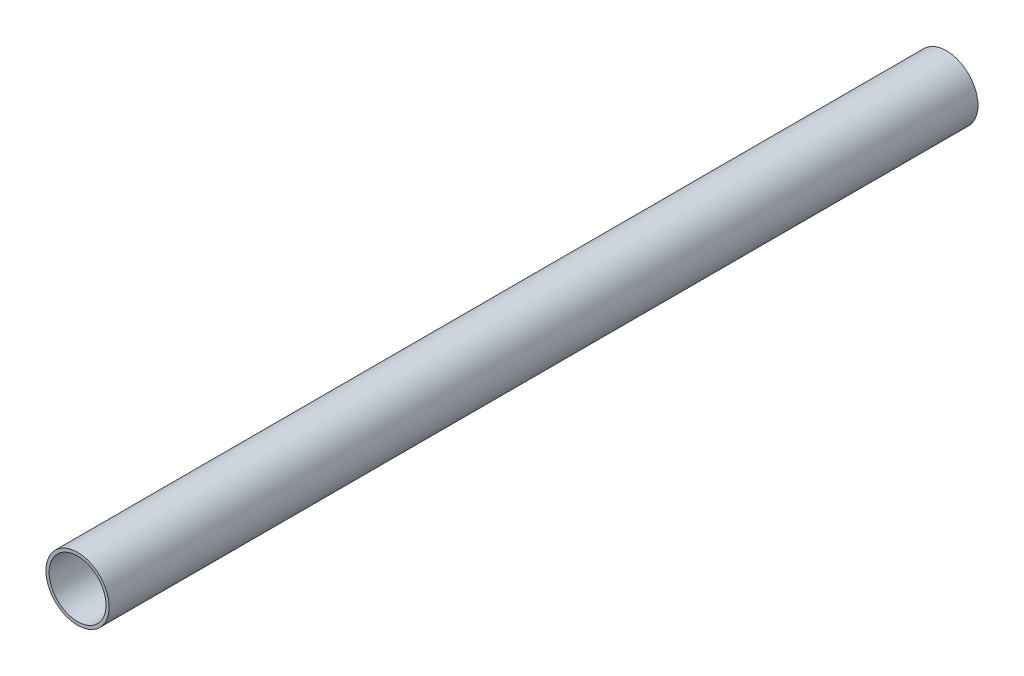
ISO-10303-21;
HEADER;
FILE_DESCRIPTION(('STEP AP214'),'2;1');
FILE_NAME('part.step','',(''),(''),'','','');
FILE_SCHEMA(('AUTOMOTIVE_DESIGN { 1 0 10303 214 1 1 1 1 }'));
ENDSEC;
DATA;
#1=APPLICATION_CONTEXT('core data for automotive mechanical design processes');
#2=APPLICATION_PROTOCOL_DEFINITION('international standard','automotive_design',2000,#1);
#3=PRODUCT_CONTEXT('',#1,'mechanical');
#4=PRODUCT('Part','Part','',(#3));
#5=PRODUCT_RELATED_PRODUCT_CATEGORY('part','',(#4));
#6=PRODUCT_DEFINITION_FORMATION('','',#4);
#7=PRODUCT_DEFINITION_CONTEXT('part definition',#1,'design');
#8=PRODUCT_DEFINITION('design','',#6,#7);
#9=PRODUCT_DEFINITION_SHAPE('','',#8);
#10=(LENGTH_UNIT() NAMED_UNIT(*) SI_UNIT(.MILLI.,.METRE.));
#11=(NAMED_UNIT(*) PLANE_ANGLE_UNIT() SI_UNIT($,.RADIAN.));
#12=(NAMED_UNIT(*) SI_UNIT($,.STERADIAN.) SOLID_ANGLE_UNIT());
#13=UNCERTAINTY_MEASURE_WITH_UNIT(LENGTH_MEASURE(1.E-05),#10,'distance_accuracy_value','');
#14=(GEOMETRIC_REPRESENTATION_CONTEXT(3) GLOBAL_UNCERTAINTY_ASSIGNED_CONTEXT((#13)) GLOBAL_UNIT_ASSIGNED_CONTEXT((#10,
#11,#12)) REPRESENTATION_CONTEXT('',''));
#15=CARTESIAN_POINT('',(0.,0.,0.));
#16=DIRECTION('',(0.,0.,1.));
#17=DIRECTION('',(1.,0.,0.));
#18=AXIS2_PLACEMENT_3D('',#15,#16,#17);
#19=CARTESIAN_POINT('',(0.,0.,110.));
#20=DIRECTION('',(0.,0.,1.));
#21=DIRECTION('',(1.,0.,0.));
#22=AXIS2_PLACEMENT_3D('',#19,#20,#21);
#23=PLANE('',#22);
#24=CARTESIAN_POINT('',(0.,0.,110.));
#25=DIRECTION('',(0.,0.,1.));
#26=DIRECTION('',(1.,0.,0.));
#27=AXIS2_PLACEMENT_3D('',#24,#25,#26);
#28=CIRCLE('',#27,8.);
#29=CARTESIAN_POINT('',(8.,0.,110.));
#30=VERTEX_POINT('',#29);
#31=EDGE_CURVE('E10',#30,#30,#28,.T.);
#32=ORIENTED_EDGE('',*,*,#31,.T.);
#33=EDGE_LOOP('',(#32));
#34=FACE_BOUND('',#33,.T.);
#35=CARTESIAN_POINT('',(0.,0.,110.));
#36=DIRECTION('',(0.,0.,1.));
#37=DIRECTION('',(1.,0.,0.));
#38=AXIS2_PLACEMENT_3D('',#35,#36,#37);
#39=CIRCLE('',#38,7.2);
#40=CARTESIAN_POINT('',(7.2,0.,110.));
#41=VERTEX_POINT('',#40);
#42=EDGE_CURVE('E41',#41,#41,#39,.T.);
#43=ORIENTED_EDGE('',*,*,#42,.F.);
#44=EDGE_LOOP('',(#43));
#45=FACE_BOUND('',#44,.T.);
#46=ADVANCED_FACE('F30',(#34,#45),#23,.T.);
#47=CARTESIAN_POINT('',(0.,0.,-110.));
#48=DIRECTION('',(0.,0.,1.));
#49=DIRECTION('',(1.,0.,0.));
#50=AXIS2_PLACEMENT_3D('',#47,#48,#49);
#51=PLANE('',#50);
#52=CARTESIAN_POINT('',(0.,0.,-110.));
#53=DIRECTION('',(0.,0.,1.));
#54=DIRECTION('',(1.,0.,0.));
#55=AXIS2_PLACEMENT_3D('',#52,#53,#54);
#56=CIRCLE('',#55,8.);
#57=CARTESIAN_POINT('',(8.,0.,-110.));
#58=VERTEX_POINT('',#57);
#59=EDGE_CURVE('E34',#58,#58,#56,.T.);
#60=ORIENTED_EDGE('',*,*,#59,.F.);
#61=EDGE_LOOP('',(#60));
#62=FACE_BOUND('',#61,.T.);
#63=CARTESIAN_POINT('',(0.,0.,-110.));
#64=DIRECTION('',(0.,0.,1.));
#65=DIRECTION('',(1.,0.,0.));
#66=AXIS2_PLACEMENT_3D('',#63,#64,#65);
#67=CIRCLE('',#66,7.2);
#68=CARTESIAN_POINT('',(7.2,0.,-110.));
#69=VERTEX_POINT('',#68);
#70=EDGE_CURVE('E43',#69,#69,#67,.T.);
#71=ORIENTED_EDGE('',*,*,#70,.T.);
#72=EDGE_LOOP('',(#71));
#73=FACE_BOUND('',#72,.T.);
#74=ADVANCED_FACE('F53',(#62,#73),#51,.F.);
#75=CARTESIAN_POINT('',(0.,0.,110.));
#76=DIRECTION('',(0.,0.,-1.));
#77=DIRECTION('',(-1.,0.,0.));
#78=AXIS2_PLACEMENT_3D('',#75,#76,#77);
#79=CYLINDRICAL_SURFACE('',#78,8.);
#80=ORIENTED_EDGE('',*,*,#31,.F.);
#81=EDGE_LOOP('',(#80));
#82=FACE_BOUND('',#81,.T.);
#83=ORIENTED_EDGE('',*,*,#59,.T.);
#84=EDGE_LOOP('',(#83));
#85=FACE_BOUND('',#84,.T.);
#86=ADVANCED_FACE('F32',(#82,#85),#79,.T.);
#87=CARTESIAN_POINT('',(0.,0.,110.));
#88=DIRECTION('',(0.,0.,-1.));
#89=DIRECTION('',(-1.,0.,0.));
#90=AXIS2_PLACEMENT_3D('',#87,#88,#89);
#91=CYLINDRICAL_SURFACE('',#90,7.2);
#92=ORIENTED_EDGE('',*,*,#42,.T.);
#93=EDGE_LOOP('',(#92));
#94=FACE_BOUND('',#93,.T.);
#95=ORIENTED_EDGE('',*,*,#70,.F.);
#96=EDGE_LOOP('',(#95));
#97=FACE_BOUND('',#96,.T.);
#98=ADVANCED_FACE('F49',(#94,#97),#91,.F.);
#99=CLOSED_SHELL('',(#46,#74,#86,#98));
#100=MANIFOLD_SOLID_BREP('B2',#99);
#101=ADVANCED_BREP_SHAPE_REPRESENTATION('',(#18,#100),#14);
#102=SHAPE_DEFINITION_REPRESENTATION(#9,#101);
ENDSEC;
END-ISO-10303-21;
